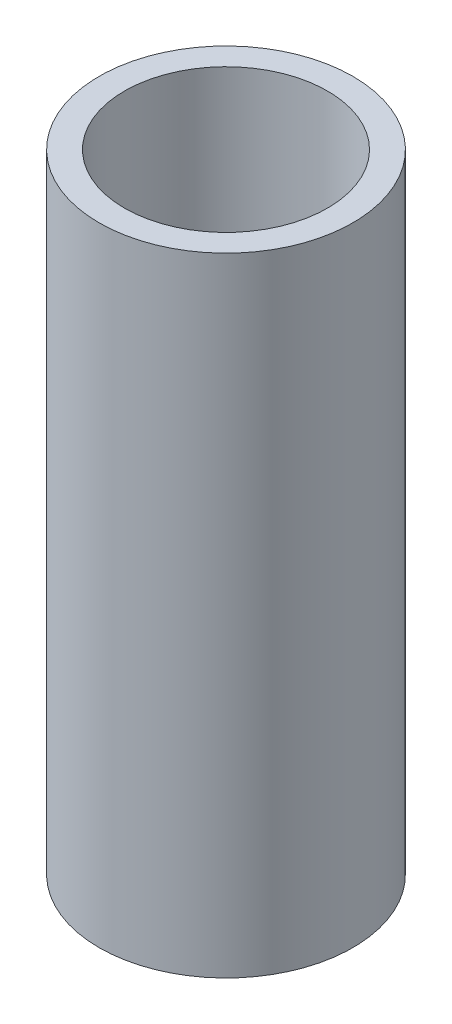
ISO-10303-21;
HEADER;
FILE_DESCRIPTION(('STEP AP214'),'2;1');
FILE_NAME('part.step','',(''),(''),'','','');
FILE_SCHEMA(('AUTOMOTIVE_DESIGN { 1 0 10303 214 1 1 1 1 }'));
ENDSEC;
DATA;
#1=APPLICATION_CONTEXT('core data for automotive mechanical design processes');
#2=APPLICATION_PROTOCOL_DEFINITION('international standard','automotive_design',2000,#1);
#3=PRODUCT_CONTEXT('',#1,'mechanical');
#4=PRODUCT('Part','Part','',(#3));
#5=PRODUCT_RELATED_PRODUCT_CATEGORY('part','',(#4));
#6=PRODUCT_DEFINITION_FORMATION('','',#4);
#7=PRODUCT_DEFINITION_CONTEXT('part definition',#1,'design');
#8=PRODUCT_DEFINITION('design','',#6,#7);
#9=PRODUCT_DEFINITION_SHAPE('','',#8);
#10=(LENGTH_UNIT() NAMED_UNIT(*) SI_UNIT(.MILLI.,.METRE.));
#11=(NAMED_UNIT(*) PLANE_ANGLE_UNIT() SI_UNIT($,.RADIAN.));
#12=(NAMED_UNIT(*) SI_UNIT($,.STERADIAN.) SOLID_ANGLE_UNIT());
#13=UNCERTAINTY_MEASURE_WITH_UNIT(LENGTH_MEASURE(1.E-05),#10,'distance_accuracy_value','');
#14=(GEOMETRIC_REPRESENTATION_CONTEXT(3) GLOBAL_UNCERTAINTY_ASSIGNED_CONTEXT((#13)) GLOBAL_UNIT_ASSIGNED_CONTEXT((#10,
#11,#12)) REPRESENTATION_CONTEXT('',''));
#15=CARTESIAN_POINT('',(0.,0.,0.));
#16=DIRECTION('',(0.,0.,1.));
#17=DIRECTION('',(1.,0.,0.));
#18=AXIS2_PLACEMENT_3D('',#15,#16,#17);
#19=CARTESIAN_POINT('',(1.9,9.4,0.));
#20=DIRECTION('',(0.,-1.,0.));
#21=DIRECTION('',(0.,0.,-1.));
#22=AXIS2_PLACEMENT_3D('',#19,#20,#21);
#23=PLANE('',#22);
#24=CARTESIAN_POINT('',(0.,9.4,0.));
#25=DIRECTION('',(0.,1.,0.));
#26=DIRECTION('',(0.,0.,1.));
#27=AXIS2_PLACEMENT_3D('',#24,#25,#26);
#28=CIRCLE('',#27,1.52);
#29=CARTESIAN_POINT('',(0.,9.4,1.52));
#30=VERTEX_POINT('',#29);
#31=EDGE_CURVE('E10',#30,#30,#28,.T.);
#32=ORIENTED_EDGE('',*,*,#31,.F.);
#33=EDGE_LOOP('',(#32));
#34=FACE_BOUND('',#33,.T.);
#35=CARTESIAN_POINT('',(0.,9.4,0.));
#36=DIRECTION('',(0.,1.,0.));
#37=DIRECTION('',(0.,0.,1.));
#38=AXIS2_PLACEMENT_3D('',#35,#36,#37);
#39=CIRCLE('',#38,1.9);
#40=CARTESIAN_POINT('',(0.,9.4,1.9));
#41=VERTEX_POINT('',#40);
#42=EDGE_CURVE('E44',#41,#41,#39,.T.);
#43=ORIENTED_EDGE('',*,*,#42,.T.);
#44=EDGE_LOOP('',(#43));
#45=FACE_BOUND('',#44,.T.);
#46=ADVANCED_FACE('F30',(#34,#45),#23,.F.);
#47=CARTESIAN_POINT('',(0.,0.,0.));
#48=DIRECTION('',(0.,1.,0.));
#49=DIRECTION('',(0.,0.,1.));
#50=AXIS2_PLACEMENT_3D('',#47,#48,#49);
#51=CYLINDRICAL_SURFACE('',#50,1.52);
#52=CARTESIAN_POINT('',(0.,0.,0.));
#53=DIRECTION('',(0.,1.,0.));
#54=DIRECTION('',(0.,0.,1.));
#55=AXIS2_PLACEMENT_3D('',#52,#53,#54);
#56=CIRCLE('',#55,1.52);
#57=CARTESIAN_POINT('',(0.,0.,1.52));
#58=VERTEX_POINT('',#57);
#59=EDGE_CURVE('E36',#58,#58,#56,.T.);
#60=ORIENTED_EDGE('',*,*,#59,.F.);
#61=EDGE_LOOP('',(#60));
#62=FACE_BOUND('',#61,.T.);
#63=ORIENTED_EDGE('',*,*,#31,.T.);
#64=EDGE_LOOP('',(#63));
#65=FACE_BOUND('',#64,.T.);
#66=ADVANCED_FACE('F59',(#62,#65),#51,.F.);
#67=CARTESIAN_POINT('',(1.52,0.,0.));
#68=DIRECTION('',(0.,1.,0.));
#69=DIRECTION('',(0.,0.,1.));
#70=AXIS2_PLACEMENT_3D('',#67,#68,#69);
#71=PLANE('',#70);
#72=CARTESIAN_POINT('',(0.,0.,0.));
#73=DIRECTION('',(0.,1.,0.));
#74=DIRECTION('',(0.,0.,1.));
#75=AXIS2_PLACEMENT_3D('',#72,#73,#74);
#76=CIRCLE('',#75,1.9);
#77=CARTESIAN_POINT('',(0.,0.,1.9));
#78=VERTEX_POINT('',#77);
#79=EDGE_CURVE('E40',#78,#78,#76,.T.);
#80=ORIENTED_EDGE('',*,*,#79,.F.);
#81=EDGE_LOOP('',(#80));
#82=FACE_BOUND('',#81,.T.);
#83=ORIENTED_EDGE('',*,*,#59,.T.);
#84=EDGE_LOOP('',(#83));
#85=FACE_BOUND('',#84,.T.);
#86=ADVANCED_FACE('F54',(#82,#85),#71,.F.);
#87=CARTESIAN_POINT('',(0.,0.,0.));
#88=DIRECTION('',(0.,1.,0.));
#89=DIRECTION('',(0.,0.,1.));
#90=AXIS2_PLACEMENT_3D('',#87,#88,#89);
#91=CYLINDRICAL_SURFACE('',#90,1.9);
#92=ORIENTED_EDGE('',*,*,#42,.F.);
#93=EDGE_LOOP('',(#92));
#94=FACE_BOUND('',#93,.T.);
#95=ORIENTED_EDGE('',*,*,#79,.T.);
#96=EDGE_LOOP('',(#95));
#97=FACE_BOUND('',#96,.T.);
#98=ADVANCED_FACE('F51',(#94,#97),#91,.T.);
#99=CLOSED_SHELL('',(#46,#66,#86,#98));
#100=MANIFOLD_SOLID_BREP('B2',#99);
#101=ADVANCED_BREP_SHAPE_REPRESENTATION('',(#18,#100),#14);
#102=SHAPE_DEFINITION_REPRESENTATION(#9,#101);
ENDSEC;
END-ISO-10303-21;
